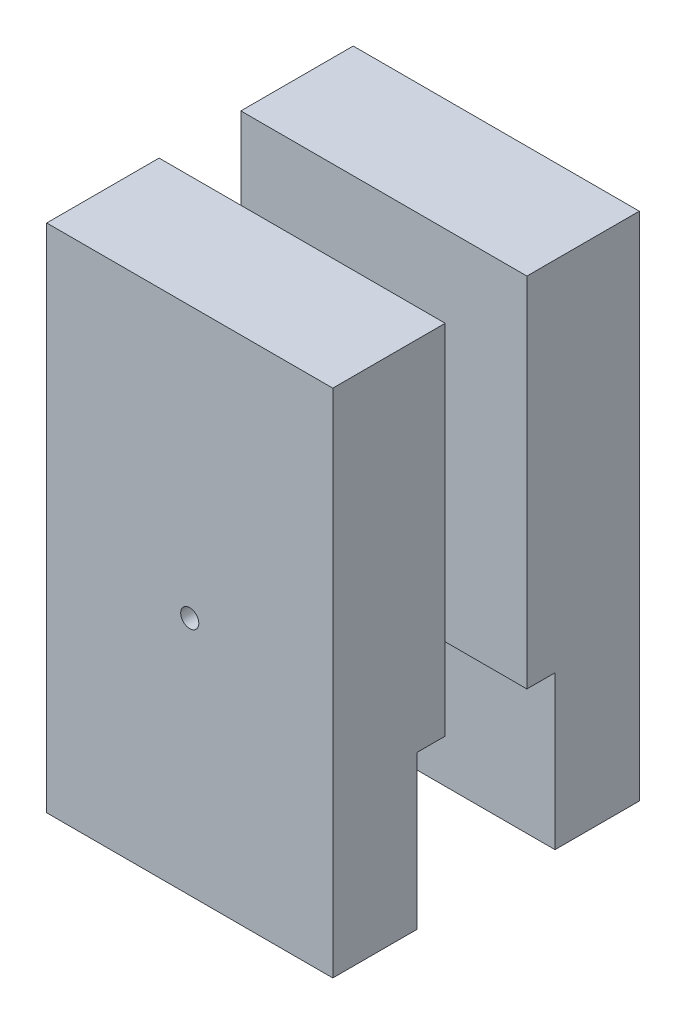
ISO-10303-21;
HEADER;
FILE_DESCRIPTION(('STEP AP214'),'2;1');
FILE_NAME('part.step','',(''),(''),'','','');
FILE_SCHEMA(('AUTOMOTIVE_DESIGN { 1 0 10303 214 1 1 1 1 }'));
ENDSEC;
DATA;
#1=APPLICATION_CONTEXT('core data for automotive mechanical design processes');
#2=APPLICATION_PROTOCOL_DEFINITION('international standard','automotive_design',2000,#1);
#3=PRODUCT_CONTEXT('',#1,'mechanical');
#4=PRODUCT('Part','Part','',(#3));
#5=PRODUCT_RELATED_PRODUCT_CATEGORY('part','',(#4));
#6=PRODUCT_DEFINITION_FORMATION('','',#4);
#7=PRODUCT_DEFINITION_CONTEXT('part definition',#1,'design');
#8=PRODUCT_DEFINITION('design','',#6,#7);
#9=PRODUCT_DEFINITION_SHAPE('','',#8);
#10=(LENGTH_UNIT() NAMED_UNIT(*) SI_UNIT(.MILLI.,.METRE.));
#11=(NAMED_UNIT(*) PLANE_ANGLE_UNIT() SI_UNIT($,.RADIAN.));
#12=(NAMED_UNIT(*) SI_UNIT($,.STERADIAN.) SOLID_ANGLE_UNIT());
#13=UNCERTAINTY_MEASURE_WITH_UNIT(LENGTH_MEASURE(1.E-05),#10,'distance_accuracy_value','');
#14=(GEOMETRIC_REPRESENTATION_CONTEXT(3) GLOBAL_UNCERTAINTY_ASSIGNED_CONTEXT((#13)) GLOBAL_UNIT_ASSIGNED_CONTEXT((#10,
#11,#12)) REPRESENTATION_CONTEXT('',''));
#15=CARTESIAN_POINT('',(0.,0.,0.));
#16=DIRECTION('',(0.,0.,1.));
#17=DIRECTION('',(1.,0.,0.));
#18=AXIS2_PLACEMENT_3D('',#15,#16,#17);
#19=CARTESIAN_POINT('',(17.78,63.5,-19.05));
#20=DIRECTION('',(-1.,0.,0.));
#21=DIRECTION('',(0.,0.,1.));
#22=AXIS2_PLACEMENT_3D('',#19,#20,#21);
#23=PLANE('',#22);
#24=DIRECTION('',(0.,1.,0.));
#25=VECTOR('',#24,1.);
#26=CARTESIAN_POINT('',(17.78,25.4,-5.08));
#27=LINE('',#26,#25);
#28=CARTESIAN_POINT('',(17.78,19.05,-5.08));
#29=VERTEX_POINT('',#28);
#30=CARTESIAN_POINT('',(17.78,63.5,-5.08));
#31=VERTEX_POINT('',#30);
#32=EDGE_CURVE('E172',#29,#31,#27,.T.);
#33=ORIENTED_EDGE('',*,*,#32,.F.);
#34=DIRECTION('',(0.,0.,1.));
#35=VECTOR('',#34,1.);
#36=CARTESIAN_POINT('',(17.78,19.05,-8.5725));
#37=LINE('',#36,#35);
#38=CARTESIAN_POINT('',(17.78,19.05,-8.5725));
#39=VERTEX_POINT('',#38);
#40=EDGE_CURVE('E261',#39,#29,#37,.T.);
#41=ORIENTED_EDGE('',*,*,#40,.F.);
#42=DIRECTION('',(0.,-1.,0.));
#43=VECTOR('',#42,1.);
#44=CARTESIAN_POINT('',(17.78,64.8773938476186,-8.5725));
#45=LINE('',#44,#43);
#46=CARTESIAN_POINT('',(17.78,0.,-8.5725));
#47=VERTEX_POINT('',#46);
#48=EDGE_CURVE('E257',#39,#47,#45,.T.);
#49=ORIENTED_EDGE('',*,*,#48,.T.);
#50=DIRECTION('',(0.,0.,-1.));
#51=VECTOR('',#50,1.);
#52=CARTESIAN_POINT('',(17.78,0.,-19.05));
#53=LINE('',#52,#51);
#54=CARTESIAN_POINT('',(17.78,0.,-19.05));
#55=VERTEX_POINT('',#54);
#56=EDGE_CURVE('E185',#47,#55,#53,.T.);
#57=ORIENTED_EDGE('',*,*,#56,.T.);
#58=DIRECTION('',(0.,-1.,0.));
#59=VECTOR('',#58,1.);
#60=CARTESIAN_POINT('',(17.78,63.5,-19.05));
#61=LINE('',#60,#59);
#62=CARTESIAN_POINT('',(17.78,63.5,-19.05));
#63=VERTEX_POINT('',#62);
#64=EDGE_CURVE('E222',#63,#55,#61,.T.);
#65=ORIENTED_EDGE('',*,*,#64,.F.);
#66=DIRECTION('',(0.,0.,-1.));
#67=VECTOR('',#66,1.);
#68=CARTESIAN_POINT('',(17.78,63.5,-19.05));
#69=LINE('',#68,#67);
#70=EDGE_CURVE('E194',#31,#63,#69,.T.);
#71=ORIENTED_EDGE('',*,*,#70,.F.);
#72=EDGE_LOOP('',(#33,#41,#49,#57,#65,#71));
#73=FACE_BOUND('',#72,.T.);
#74=ADVANCED_FACE('F37',(#73),#23,.F.);
#75=CARTESIAN_POINT('',(-17.78,63.5,-19.05));
#76=DIRECTION('',(1.,0.,0.));
#77=DIRECTION('',(0.,0.,-1.));
#78=AXIS2_PLACEMENT_3D('',#75,#76,#77);
#79=PLANE('',#78);
#80=DIRECTION('',(0.,1.,0.));
#81=VECTOR('',#80,1.);
#82=CARTESIAN_POINT('',(-17.78,25.4,5.08));
#83=LINE('',#82,#81);
#84=CARTESIAN_POINT('',(-17.78,19.05,5.08));
#85=VERTEX_POINT('',#84);
#86=CARTESIAN_POINT('',(-17.78,63.5,5.08));
#87=VERTEX_POINT('',#86);
#88=EDGE_CURVE('E186',#85,#87,#83,.T.);
#89=ORIENTED_EDGE('',*,*,#88,.F.);
#90=DIRECTION('',(0.,0.,-1.));
#91=VECTOR('',#90,1.);
#92=CARTESIAN_POINT('',(-17.78,19.05,-8.5725));
#93=LINE('',#92,#91);
#94=CARTESIAN_POINT('',(-17.78,19.05,8.5725));
#95=VERTEX_POINT('',#94);
#96=EDGE_CURVE('E247',#95,#85,#93,.T.);
#97=ORIENTED_EDGE('',*,*,#96,.F.);
#98=DIRECTION('',(0.,-1.,0.));
#99=VECTOR('',#98,1.);
#100=CARTESIAN_POINT('',(-17.78,64.8773938476186,8.5725));
#101=LINE('',#100,#99);
#102=CARTESIAN_POINT('',(-17.78,0.,8.5725));
#103=VERTEX_POINT('',#102);
#104=EDGE_CURVE('E248',#95,#103,#101,.T.);
#105=ORIENTED_EDGE('',*,*,#104,.T.);
#106=DIRECTION('',(0.,0.,1.));
#107=VECTOR('',#106,1.);
#108=CARTESIAN_POINT('',(-17.78,0.,-19.05));
#109=LINE('',#108,#107);
#110=CARTESIAN_POINT('',(-17.78,0.,19.05));
#111=VERTEX_POINT('',#110);
#112=EDGE_CURVE('E208',#103,#111,#109,.T.);
#113=ORIENTED_EDGE('',*,*,#112,.T.);
#114=DIRECTION('',(0.,-1.,0.));
#115=VECTOR('',#114,1.);
#116=CARTESIAN_POINT('',(-17.78,63.5,19.05));
#117=LINE('',#116,#115);
#118=CARTESIAN_POINT('',(-17.78,63.5,19.05));
#119=VERTEX_POINT('',#118);
#120=EDGE_CURVE('E216',#119,#111,#117,.T.);
#121=ORIENTED_EDGE('',*,*,#120,.F.);
#122=DIRECTION('',(0.,0.,1.));
#123=VECTOR('',#122,1.);
#124=CARTESIAN_POINT('',(-17.78,63.5,-19.05));
#125=LINE('',#124,#123);
#126=EDGE_CURVE('E196',#87,#119,#125,.T.);
#127=ORIENTED_EDGE('',*,*,#126,.F.);
#128=EDGE_LOOP('',(#89,#97,#105,#113,#121,#127));
#129=FACE_BOUND('',#128,.T.);
#130=ADVANCED_FACE('F312',(#129),#79,.F.);
#131=CARTESIAN_POINT('',(0.,25.4,0.));
#132=DIRECTION('',(0.,1.,0.));
#133=DIRECTION('',(0.,0.,1.));
#134=AXIS2_PLACEMENT_3D('',#131,#132,#133);
#135=PLANE('',#134);
#136=DIRECTION('',(0.,0.,-1.));
#137=VECTOR('',#136,1.);
#138=CARTESIAN_POINT('',(-0.635,25.4,0.));
#139=LINE('',#138,#137);
#140=CARTESIAN_POINT('',(-0.635,25.4,5.08));
#141=VERTEX_POINT('',#140);
#142=CARTESIAN_POINT('',(-0.635,25.4,-5.08));
#143=VERTEX_POINT('',#142);
#144=EDGE_CURVE('E152',#141,#143,#139,.T.);
#145=ORIENTED_EDGE('',*,*,#144,.F.);
#146=DIRECTION('',(1.,0.,0.));
#147=VECTOR('',#146,1.);
#148=CARTESIAN_POINT('',(-17.78,25.4,5.08));
#149=LINE('',#148,#147);
#150=CARTESIAN_POINT('',(0.635,25.4,5.08));
#151=VERTEX_POINT('',#150);
#152=EDGE_CURVE('E163',#141,#151,#149,.T.);
#153=ORIENTED_EDGE('',*,*,#152,.T.);
#154=DIRECTION('',(0.,0.,-1.));
#155=VECTOR('',#154,1.);
#156=CARTESIAN_POINT('',(0.635,25.4,0.));
#157=LINE('',#156,#155);
#158=CARTESIAN_POINT('',(0.635,25.4,-5.08));
#159=VERTEX_POINT('',#158);
#160=EDGE_CURVE('E276',#151,#159,#157,.T.);
#161=ORIENTED_EDGE('',*,*,#160,.T.);
#162=DIRECTION('',(-1.,0.,0.));
#163=VECTOR('',#162,1.);
#164=CARTESIAN_POINT('',(-17.78,25.4,-5.08));
#165=LINE('',#164,#163);
#166=EDGE_CURVE('E165',#159,#143,#165,.T.);
#167=ORIENTED_EDGE('',*,*,#166,.T.);
#168=EDGE_LOOP('',(#145,#153,#161,#167));
#169=FACE_BOUND('',#168,.T.);
#170=ADVANCED_FACE('F161',(#169),#135,.T.);
#171=CARTESIAN_POINT('',(0.,0.,0.));
#172=DIRECTION('',(0.,1.,0.));
#173=DIRECTION('',(0.,0.,1.));
#174=AXIS2_PLACEMENT_3D('',#171,#172,#173);
#175=PLANE('',#174);
#176=ORIENTED_EDGE('',*,*,#112,.F.);
#177=DIRECTION('',(-1.,0.,0.));
#178=VECTOR('',#177,1.);
#179=CARTESIAN_POINT('',(-17.78,0.,8.5725));
#180=LINE('',#179,#178);
#181=CARTESIAN_POINT('',(17.78,0.,8.5725));
#182=VERTEX_POINT('',#181);
#183=EDGE_CURVE('E272',#182,#103,#180,.T.);
#184=ORIENTED_EDGE('',*,*,#183,.F.);
#185=CARTESIAN_POINT('',(17.78,0.,19.05));
#186=VERTEX_POINT('',#185);
#187=EDGE_CURVE('E203',#186,#182,#53,.T.);
#188=ORIENTED_EDGE('',*,*,#187,.F.);
#189=DIRECTION('',(1.,0.,0.));
#190=VECTOR('',#189,1.);
#191=CARTESIAN_POINT('',(-17.78,0.,19.05));
#192=LINE('',#191,#190);
#193=EDGE_CURVE('E212',#111,#186,#192,.T.);
#194=ORIENTED_EDGE('',*,*,#193,.F.);
#195=EDGE_LOOP('',(#176,#184,#188,#194));
#196=FACE_BOUND('',#195,.T.);
#197=ADVANCED_FACE('F308',(#196),#175,.F.);
#198=CARTESIAN_POINT('',(0.,63.5,0.));
#199=DIRECTION('',(0.,1.,0.));
#200=DIRECTION('',(0.,0.,1.));
#201=AXIS2_PLACEMENT_3D('',#198,#199,#200);
#202=PLANE('',#201);
#203=DIRECTION('',(1.,0.,0.));
#204=VECTOR('',#203,1.);
#205=CARTESIAN_POINT('',(-17.78,63.5,5.08));
#206=LINE('',#205,#204);
#207=CARTESIAN_POINT('',(17.78,63.5,5.08));
#208=VERTEX_POINT('',#207);
#209=EDGE_CURVE('E176',#87,#208,#206,.T.);
#210=ORIENTED_EDGE('',*,*,#209,.F.);
#211=ORIENTED_EDGE('',*,*,#126,.T.);
#212=DIRECTION('',(1.,0.,0.));
#213=VECTOR('',#212,1.);
#214=CARTESIAN_POINT('',(-17.78,63.5,19.05));
#215=LINE('',#214,#213);
#216=CARTESIAN_POINT('',(17.78,63.5,19.05));
#217=VERTEX_POINT('',#216);
#218=EDGE_CURVE('E200',#119,#217,#215,.T.);
#219=ORIENTED_EDGE('',*,*,#218,.T.);
#220=EDGE_CURVE('E190',#217,#208,#69,.T.);
#221=ORIENTED_EDGE('',*,*,#220,.T.);
#222=EDGE_LOOP('',(#210,#211,#219,#221));
#223=FACE_BOUND('',#222,.T.);
#224=ADVANCED_FACE('F316',(#223),#202,.T.);
#225=CARTESIAN_POINT('',(17.78,19.05,5.08));
#226=VERTEX_POINT('',#225);
#227=CARTESIAN_POINT('',(17.78,19.05,8.5725));
#228=VERTEX_POINT('',#227);
#229=EDGE_CURVE('E260',#226,#228,#37,.T.);
#230=ORIENTED_EDGE('',*,*,#229,.F.);
#231=DIRECTION('',(0.,1.,0.));
#232=VECTOR('',#231,1.);
#233=CARTESIAN_POINT('',(17.78,25.4,5.08));
#234=LINE('',#233,#232);
#235=EDGE_CURVE('E61',#226,#208,#234,.T.);
#236=ORIENTED_EDGE('',*,*,#235,.T.);
#237=ORIENTED_EDGE('',*,*,#220,.F.);
#238=DIRECTION('',(0.,-1.,0.));
#239=VECTOR('',#238,1.);
#240=CARTESIAN_POINT('',(17.78,63.5,19.05));
#241=LINE('',#240,#239);
#242=EDGE_CURVE('E202',#217,#186,#241,.T.);
#243=ORIENTED_EDGE('',*,*,#242,.T.);
#244=ORIENTED_EDGE('',*,*,#187,.T.);
#245=DIRECTION('',(0.,-1.,0.));
#246=VECTOR('',#245,1.);
#247=CARTESIAN_POINT('',(17.78,64.8773938476186,8.5725));
#248=LINE('',#247,#246);
#249=EDGE_CURVE('E182',#228,#182,#248,.T.);
#250=ORIENTED_EDGE('',*,*,#249,.F.);
#251=EDGE_LOOP('',(#230,#236,#237,#243,#244,#250));
#252=FACE_BOUND('',#251,.T.);
#253=ADVANCED_FACE('F39',(#252),#23,.F.);
#254=CARTESIAN_POINT('',(-17.78,63.5,-19.05));
#255=DIRECTION('',(0.,0.,1.));
#256=DIRECTION('',(1.,0.,0.));
#257=AXIS2_PLACEMENT_3D('',#254,#255,#256);
#258=PLANE('',#257);
#259=CARTESIAN_POINT('',(0.,29.845,-19.05));
#260=DIRECTION('',(0.,0.,1.));
#261=DIRECTION('',(1.,0.,0.));
#262=AXIS2_PLACEMENT_3D('',#259,#260,#261);
#263=CIRCLE('',#262,1.125);
#264=CARTESIAN_POINT('',(1.125,29.845,-19.05));
#265=VERTEX_POINT('',#264);
#266=EDGE_CURVE('E283',#265,#265,#263,.T.);
#267=ORIENTED_EDGE('',*,*,#266,.T.);
#268=EDGE_LOOP('',(#267));
#269=FACE_BOUND('',#268,.T.);
#270=DIRECTION('',(-1.,0.,0.));
#271=VECTOR('',#270,1.);
#272=CARTESIAN_POINT('',(-17.78,0.,-19.05));
#273=LINE('',#272,#271);
#274=CARTESIAN_POINT('',(-17.78,0.,-19.05));
#275=VERTEX_POINT('',#274);
#276=EDGE_CURVE('E206',#55,#275,#273,.T.);
#277=ORIENTED_EDGE('',*,*,#276,.T.);
#278=DIRECTION('',(0.,-1.,0.));
#279=VECTOR('',#278,1.);
#280=CARTESIAN_POINT('',(-17.78,63.5,-19.05));
#281=LINE('',#280,#279);
#282=CARTESIAN_POINT('',(-17.78,63.5,-19.05));
#283=VERTEX_POINT('',#282);
#284=EDGE_CURVE('E219',#283,#275,#281,.T.);
#285=ORIENTED_EDGE('',*,*,#284,.F.);
#286=DIRECTION('',(-1.,0.,0.));
#287=VECTOR('',#286,1.);
#288=CARTESIAN_POINT('',(-17.78,63.5,-19.05));
#289=LINE('',#288,#287);
#290=EDGE_CURVE('E193',#63,#283,#289,.T.);
#291=ORIENTED_EDGE('',*,*,#290,.F.);
#292=ORIENTED_EDGE('',*,*,#64,.T.);
#293=EDGE_LOOP('',(#277,#285,#291,#292));
#294=FACE_BOUND('',#293,.T.);
#295=ADVANCED_FACE('F323',(#269,#294),#258,.F.);
#296=CARTESIAN_POINT('',(-17.78,19.05,-5.08));
#297=VERTEX_POINT('',#296);
#298=CARTESIAN_POINT('',(-17.78,19.05,-8.5725));
#299=VERTEX_POINT('',#298);
#300=EDGE_CURVE('E239',#297,#299,#93,.T.);
#301=ORIENTED_EDGE('',*,*,#300,.F.);
#302=DIRECTION('',(0.,1.,0.));
#303=VECTOR('',#302,1.);
#304=CARTESIAN_POINT('',(-17.78,25.4,-5.08));
#305=LINE('',#304,#303);
#306=CARTESIAN_POINT('',(-17.78,63.5,-5.08));
#307=VERTEX_POINT('',#306);
#308=EDGE_CURVE('E174',#297,#307,#305,.T.);
#309=ORIENTED_EDGE('',*,*,#308,.T.);
#310=EDGE_CURVE('E197',#283,#307,#125,.T.);
#311=ORIENTED_EDGE('',*,*,#310,.F.);
#312=ORIENTED_EDGE('',*,*,#284,.T.);
#313=CARTESIAN_POINT('',(-17.78,0.,-8.5725));
#314=VERTEX_POINT('',#313);
#315=EDGE_CURVE('E209',#275,#314,#109,.T.);
#316=ORIENTED_EDGE('',*,*,#315,.T.);
#317=DIRECTION('',(0.,-1.,0.));
#318=VECTOR('',#317,1.);
#319=CARTESIAN_POINT('',(-17.78,64.8773938476186,-8.5725));
#320=LINE('',#319,#318);
#321=EDGE_CURVE('E246',#299,#314,#320,.T.);
#322=ORIENTED_EDGE('',*,*,#321,.F.);
#323=EDGE_LOOP('',(#301,#309,#311,#312,#316,#322));
#324=FACE_BOUND('',#323,.T.);
#325=ADVANCED_FACE('F244',(#324),#79,.F.);
#326=CARTESIAN_POINT('',(-17.78,63.5,19.05));
#327=DIRECTION('',(0.,0.,-1.));
#328=DIRECTION('',(-1.,0.,0.));
#329=AXIS2_PLACEMENT_3D('',#326,#327,#328);
#330=PLANE('',#329);
#331=CARTESIAN_POINT('',(0.,29.845,19.05));
#332=DIRECTION('',(0.,0.,1.));
#333=DIRECTION('',(1.,0.,0.));
#334=AXIS2_PLACEMENT_3D('',#331,#332,#333);
#335=CIRCLE('',#334,1.125);
#336=CARTESIAN_POINT('',(1.125,29.845,19.05));
#337=VERTEX_POINT('',#336);
#338=EDGE_CURVE('E286',#337,#337,#335,.T.);
#339=ORIENTED_EDGE('',*,*,#338,.F.);
#340=EDGE_LOOP('',(#339));
#341=FACE_BOUND('',#340,.T.);
#342=ORIENTED_EDGE('',*,*,#193,.T.);
#343=ORIENTED_EDGE('',*,*,#242,.F.);
#344=ORIENTED_EDGE('',*,*,#218,.F.);
#345=ORIENTED_EDGE('',*,*,#120,.T.);
#346=EDGE_LOOP('',(#342,#343,#344,#345));
#347=FACE_BOUND('',#346,.T.);
#348=ADVANCED_FACE('F293',(#341,#347),#330,.F.);
#349=DIRECTION('',(-1.,0.,0.));
#350=VECTOR('',#349,1.);
#351=CARTESIAN_POINT('',(-17.78,63.5,-5.08));
#352=LINE('',#351,#350);
#353=EDGE_CURVE('E180',#31,#307,#352,.T.);
#354=ORIENTED_EDGE('',*,*,#353,.F.);
#355=ORIENTED_EDGE('',*,*,#70,.T.);
#356=ORIENTED_EDGE('',*,*,#290,.T.);
#357=ORIENTED_EDGE('',*,*,#310,.T.);
#358=EDGE_LOOP('',(#354,#355,#356,#357));
#359=FACE_BOUND('',#358,.T.);
#360=ADVANCED_FACE('F296',(#359),#202,.T.);
#361=ORIENTED_EDGE('',*,*,#56,.F.);
#362=DIRECTION('',(1.,0.,0.));
#363=VECTOR('',#362,1.);
#364=CARTESIAN_POINT('',(-17.78,0.,-8.5725));
#365=LINE('',#364,#363);
#366=EDGE_CURVE('E271',#314,#47,#365,.T.);
#367=ORIENTED_EDGE('',*,*,#366,.F.);
#368=ORIENTED_EDGE('',*,*,#315,.F.);
#369=ORIENTED_EDGE('',*,*,#276,.F.);
#370=EDGE_LOOP('',(#361,#367,#368,#369));
#371=FACE_BOUND('',#370,.T.);
#372=ADVANCED_FACE('F325',(#371),#175,.F.);
#373=CARTESIAN_POINT('',(-17.78,25.4,5.08));
#374=DIRECTION('',(0.,0.,1.));
#375=DIRECTION('',(1.,0.,0.));
#376=AXIS2_PLACEMENT_3D('',#373,#374,#375);
#377=PLANE('',#376);
#378=CARTESIAN_POINT('',(0.,29.845,5.08));
#379=DIRECTION('',(0.,0.,1.));
#380=DIRECTION('',(1.,0.,0.));
#381=AXIS2_PLACEMENT_3D('',#378,#379,#380);
#382=CIRCLE('',#381,1.125);
#383=CARTESIAN_POINT('',(1.125,29.845,5.08));
#384=VERTEX_POINT('',#383);
#385=EDGE_CURVE('E278',#384,#384,#382,.T.);
#386=ORIENTED_EDGE('',*,*,#385,.T.);
#387=EDGE_LOOP('',(#386));
#388=FACE_BOUND('',#387,.T.);
#389=ORIENTED_EDGE('',*,*,#209,.T.);
#390=ORIENTED_EDGE('',*,*,#235,.F.);
#391=DIRECTION('',(1.,0.,0.));
#392=VECTOR('',#391,1.);
#393=CARTESIAN_POINT('',(0.,19.05,5.08));
#394=LINE('',#393,#392);
#395=CARTESIAN_POINT('',(0.635,19.05,5.08));
#396=VERTEX_POINT('',#395);
#397=EDGE_CURVE('E225',#396,#226,#394,.T.);
#398=ORIENTED_EDGE('',*,*,#397,.F.);
#399=DIRECTION('',(0.,1.,0.));
#400=VECTOR('',#399,1.);
#401=CARTESIAN_POINT('',(0.635,0.,5.08));
#402=LINE('',#401,#400);
#403=EDGE_CURVE('E170',#396,#151,#402,.T.);
#404=ORIENTED_EDGE('',*,*,#403,.T.);
#405=ORIENTED_EDGE('',*,*,#152,.F.);
#406=DIRECTION('',(0.,1.,0.));
#407=VECTOR('',#406,1.);
#408=CARTESIAN_POINT('',(-0.635,0.,5.08));
#409=LINE('',#408,#407);
#410=CARTESIAN_POINT('',(-0.635,19.05,5.08));
#411=VERTEX_POINT('',#410);
#412=EDGE_CURVE('E149',#411,#141,#409,.T.);
#413=ORIENTED_EDGE('',*,*,#412,.F.);
#414=DIRECTION('',(1.,0.,0.));
#415=VECTOR('',#414,1.);
#416=CARTESIAN_POINT('',(0.,19.05,5.08));
#417=LINE('',#416,#415);
#418=EDGE_CURVE('E12',#85,#411,#417,.T.);
#419=ORIENTED_EDGE('',*,*,#418,.F.);
#420=ORIENTED_EDGE('',*,*,#88,.T.);
#421=EDGE_LOOP('',(#389,#390,#398,#404,#405,#413,#419,#420));
#422=FACE_BOUND('',#421,.T.);
#423=ADVANCED_FACE('F168',(#388,#422),#377,.F.);
#424=CARTESIAN_POINT('',(-17.78,25.4,-5.08));
#425=DIRECTION('',(0.,0.,-1.));
#426=DIRECTION('',(-1.,0.,0.));
#427=AXIS2_PLACEMENT_3D('',#424,#425,#426);
#428=PLANE('',#427);
#429=CARTESIAN_POINT('',(0.,29.845,-5.08));
#430=DIRECTION('',(0.,0.,-1.));
#431=DIRECTION('',(-1.,0.,0.));
#432=AXIS2_PLACEMENT_3D('',#429,#430,#431);
#433=CIRCLE('',#432,1.125);
#434=CARTESIAN_POINT('',(1.125,29.845,-5.08));
#435=VERTEX_POINT('',#434);
#436=EDGE_CURVE('E41',#435,#435,#433,.T.);
#437=ORIENTED_EDGE('',*,*,#436,.T.);
#438=EDGE_LOOP('',(#437));
#439=FACE_BOUND('',#438,.T.);
#440=ORIENTED_EDGE('',*,*,#353,.T.);
#441=ORIENTED_EDGE('',*,*,#308,.F.);
#442=DIRECTION('',(-1.,0.,0.));
#443=VECTOR('',#442,1.);
#444=CARTESIAN_POINT('',(0.,19.05,-5.08));
#445=LINE('',#444,#443);
#446=CARTESIAN_POINT('',(-0.635,19.05,-5.08));
#447=VERTEX_POINT('',#446);
#448=EDGE_CURVE('E46',#447,#297,#445,.T.);
#449=ORIENTED_EDGE('',*,*,#448,.F.);
#450=DIRECTION('',(0.,1.,0.));
#451=VECTOR('',#450,1.);
#452=CARTESIAN_POINT('',(-0.635,0.,-5.08));
#453=LINE('',#452,#451);
#454=EDGE_CURVE('E53',#447,#143,#453,.T.);
#455=ORIENTED_EDGE('',*,*,#454,.T.);
#456=ORIENTED_EDGE('',*,*,#166,.F.);
#457=DIRECTION('',(0.,1.,0.));
#458=VECTOR('',#457,1.);
#459=CARTESIAN_POINT('',(0.635,0.,-5.08));
#460=LINE('',#459,#458);
#461=CARTESIAN_POINT('',(0.635,19.05,-5.08));
#462=VERTEX_POINT('',#461);
#463=EDGE_CURVE('E166',#462,#159,#460,.T.);
#464=ORIENTED_EDGE('',*,*,#463,.F.);
#465=DIRECTION('',(-1.,0.,0.));
#466=VECTOR('',#465,1.);
#467=CARTESIAN_POINT('',(0.,19.05,-5.08));
#468=LINE('',#467,#466);
#469=EDGE_CURVE('E229',#29,#462,#468,.T.);
#470=ORIENTED_EDGE('',*,*,#469,.F.);
#471=ORIENTED_EDGE('',*,*,#32,.T.);
#472=EDGE_LOOP('',(#440,#441,#449,#455,#456,#464,#470,#471));
#473=FACE_BOUND('',#472,.T.);
#474=ADVANCED_FACE('F340',(#439,#473),#428,.F.);
#475=CARTESIAN_POINT('',(0.,19.05,0.));
#476=DIRECTION('',(0.,1.,0.));
#477=DIRECTION('',(0.,0.,1.));
#478=AXIS2_PLACEMENT_3D('',#475,#476,#477);
#479=PLANE('',#478);
#480=ORIENTED_EDGE('',*,*,#96,.T.);
#481=ORIENTED_EDGE('',*,*,#418,.T.);
#482=DIRECTION('',(0.,0.,-1.));
#483=VECTOR('',#482,1.);
#484=CARTESIAN_POINT('',(-0.635,19.05,0.));
#485=LINE('',#484,#483);
#486=EDGE_CURVE('E155',#411,#447,#485,.T.);
#487=ORIENTED_EDGE('',*,*,#486,.T.);
#488=ORIENTED_EDGE('',*,*,#448,.T.);
#489=ORIENTED_EDGE('',*,*,#300,.T.);
#490=DIRECTION('',(1.,0.,0.));
#491=VECTOR('',#490,1.);
#492=CARTESIAN_POINT('',(-17.78,19.05,-8.5725));
#493=LINE('',#492,#491);
#494=EDGE_CURVE('E255',#299,#39,#493,.T.);
#495=ORIENTED_EDGE('',*,*,#494,.T.);
#496=ORIENTED_EDGE('',*,*,#40,.T.);
#497=ORIENTED_EDGE('',*,*,#469,.T.);
#498=DIRECTION('',(0.,0.,-1.));
#499=VECTOR('',#498,1.);
#500=CARTESIAN_POINT('',(0.635,19.05,0.));
#501=LINE('',#500,#499);
#502=EDGE_CURVE('E227',#396,#462,#501,.T.);
#503=ORIENTED_EDGE('',*,*,#502,.F.);
#504=ORIENTED_EDGE('',*,*,#397,.T.);
#505=ORIENTED_EDGE('',*,*,#229,.T.);
#506=DIRECTION('',(-1.,0.,0.));
#507=VECTOR('',#506,1.);
#508=CARTESIAN_POINT('',(-17.78,19.05,8.5725));
#509=LINE('',#508,#507);
#510=EDGE_CURVE('E251',#228,#95,#509,.T.);
#511=ORIENTED_EDGE('',*,*,#510,.T.);
#512=EDGE_LOOP('',(#480,#481,#487,#488,#489,#495,#496,#497,#503,#504,#505,#511));
#513=FACE_BOUND('',#512,.T.);
#514=ADVANCED_FACE('F237',(#513),#479,.F.);
#515=CARTESIAN_POINT('',(-17.78,64.8773938476186,8.5725));
#516=DIRECTION('',(0.,0.,1.));
#517=DIRECTION('',(1.,0.,0.));
#518=AXIS2_PLACEMENT_3D('',#515,#516,#517);
#519=PLANE('',#518);
#520=ORIENTED_EDGE('',*,*,#249,.T.);
#521=ORIENTED_EDGE('',*,*,#183,.T.);
#522=ORIENTED_EDGE('',*,*,#104,.F.);
#523=ORIENTED_EDGE('',*,*,#510,.F.);
#524=EDGE_LOOP('',(#520,#521,#522,#523));
#525=FACE_BOUND('',#524,.T.);
#526=ADVANCED_FACE('F309',(#525),#519,.F.);
#527=CARTESIAN_POINT('',(-17.78,64.8773938476186,-8.5725));
#528=DIRECTION('',(0.,0.,-1.));
#529=DIRECTION('',(-1.,0.,0.));
#530=AXIS2_PLACEMENT_3D('',#527,#528,#529);
#531=PLANE('',#530);
#532=ORIENTED_EDGE('',*,*,#321,.T.);
#533=ORIENTED_EDGE('',*,*,#366,.T.);
#534=ORIENTED_EDGE('',*,*,#48,.F.);
#535=ORIENTED_EDGE('',*,*,#494,.F.);
#536=EDGE_LOOP('',(#532,#533,#534,#535));
#537=FACE_BOUND('',#536,.T.);
#538=ADVANCED_FACE('F345',(#537),#531,.F.);
#539=CARTESIAN_POINT('',(0.635,0.,0.));
#540=DIRECTION('',(1.,0.,0.));
#541=DIRECTION('',(0.,0.,-1.));
#542=AXIS2_PLACEMENT_3D('',#539,#540,#541);
#543=PLANE('',#542);
#544=ORIENTED_EDGE('',*,*,#502,.T.);
#545=ORIENTED_EDGE('',*,*,#463,.T.);
#546=ORIENTED_EDGE('',*,*,#160,.F.);
#547=ORIENTED_EDGE('',*,*,#403,.F.);
#548=EDGE_LOOP('',(#544,#545,#546,#547));
#549=FACE_BOUND('',#548,.T.);
#550=ADVANCED_FACE('F343',(#549),#543,.T.);
#551=CARTESIAN_POINT('',(-0.635,0.,0.));
#552=DIRECTION('',(1.,0.,0.));
#553=DIRECTION('',(0.,0.,-1.));
#554=AXIS2_PLACEMENT_3D('',#551,#552,#553);
#555=PLANE('',#554);
#556=ORIENTED_EDGE('',*,*,#412,.T.);
#557=ORIENTED_EDGE('',*,*,#144,.T.);
#558=ORIENTED_EDGE('',*,*,#454,.F.);
#559=ORIENTED_EDGE('',*,*,#486,.F.);
#560=EDGE_LOOP('',(#556,#557,#558,#559));
#561=FACE_BOUND('',#560,.T.);
#562=ADVANCED_FACE('F151',(#561),#555,.F.);
#563=CARTESIAN_POINT('',(0.,29.845,-19.05));
#564=DIRECTION('',(0.,0.,1.));
#565=DIRECTION('',(1.,0.,0.));
#566=AXIS2_PLACEMENT_3D('',#563,#564,#565);
#567=CYLINDRICAL_SURFACE('',#566,1.125);
#568=CARTESIAN_POINT('',(1.125,29.845,-19.05));
#569=CARTESIAN_POINT('',(1.125,29.845,-18.9044791666667));
#570=CARTESIAN_POINT('',(1.125,29.845,-18.7589583333333));
#571=CARTESIAN_POINT('',(1.125,29.845,-18.4679166666667));
#572=CARTESIAN_POINT('',(1.125,29.845,-18.3223958333333));
#573=CARTESIAN_POINT('',(1.125,29.845,-18.0313541666667));
#574=CARTESIAN_POINT('',(1.125,29.845,-17.8858333333333));
#575=CARTESIAN_POINT('',(1.125,29.845,-17.5947916666667));
#576=CARTESIAN_POINT('',(1.125,29.845,-17.4492708333333));
#577=CARTESIAN_POINT('',(1.125,29.845,-17.1582291666667));
#578=CARTESIAN_POINT('',(1.125,29.845,-17.0127083333333));
#579=CARTESIAN_POINT('',(1.125,29.845,-16.7216666666667));
#580=CARTESIAN_POINT('',(1.125,29.845,-16.5761458333333));
#581=CARTESIAN_POINT('',(1.125,29.845,-16.2851041666667));
#582=CARTESIAN_POINT('',(1.125,29.845,-16.1395833333333));
#583=CARTESIAN_POINT('',(1.125,29.845,-15.8485416666667));
#584=CARTESIAN_POINT('',(1.125,29.845,-15.7030208333333));
#585=CARTESIAN_POINT('',(1.125,29.845,-15.4119791666667));
#586=CARTESIAN_POINT('',(1.125,29.845,-15.2664583333333));
#587=CARTESIAN_POINT('',(1.125,29.845,-14.9754166666667));
#588=CARTESIAN_POINT('',(1.125,29.845,-14.8298958333333));
#589=CARTESIAN_POINT('',(1.125,29.845,-14.5388541666667));
#590=CARTESIAN_POINT('',(1.125,29.845,-14.3933333333333));
#591=CARTESIAN_POINT('',(1.125,29.845,-14.1022916666667));
#592=CARTESIAN_POINT('',(1.125,29.845,-13.9567708333333));
#593=CARTESIAN_POINT('',(1.125,29.845,-13.6657291666667));
#594=CARTESIAN_POINT('',(1.125,29.845,-13.5202083333333));
#595=CARTESIAN_POINT('',(1.125,29.845,-13.2291666666667));
#596=CARTESIAN_POINT('',(1.125,29.845,-13.0836458333333));
#597=CARTESIAN_POINT('',(1.125,29.845,-12.7926041666667));
#598=CARTESIAN_POINT('',(1.125,29.845,-12.6470833333333));
#599=CARTESIAN_POINT('',(1.125,29.845,-12.3560416666667));
#600=CARTESIAN_POINT('',(1.125,29.845,-12.2105208333333));
#601=CARTESIAN_POINT('',(1.125,29.845,-11.9194791666667));
#602=CARTESIAN_POINT('',(1.125,29.845,-11.7739583333333));
#603=CARTESIAN_POINT('',(1.125,29.845,-11.4829166666667));
#604=CARTESIAN_POINT('',(1.125,29.845,-11.3373958333333));
#605=CARTESIAN_POINT('',(1.125,29.845,-11.0463541666667));
#606=CARTESIAN_POINT('',(1.125,29.845,-10.9008333333333));
#607=CARTESIAN_POINT('',(1.125,29.845,-10.6097916666667));
#608=CARTESIAN_POINT('',(1.125,29.845,-10.4642708333333));
#609=CARTESIAN_POINT('',(1.125,29.845,-10.1732291666667));
#610=CARTESIAN_POINT('',(1.125,29.845,-10.0277083333333));
#611=CARTESIAN_POINT('',(1.125,29.845,-9.73666666666667));
#612=CARTESIAN_POINT('',(1.125,29.845,-9.59114583333334));
#613=CARTESIAN_POINT('',(1.125,29.845,-9.30010416666667));
#614=CARTESIAN_POINT('',(1.125,29.845,-9.15458333333334));
#615=CARTESIAN_POINT('',(1.125,29.845,-8.86354166666667));
#616=CARTESIAN_POINT('',(1.125,29.845,-8.71802083333333));
#617=CARTESIAN_POINT('',(1.125,29.845,-8.42697916666667));
#618=CARTESIAN_POINT('',(1.125,29.845,-8.28145833333333));
#619=CARTESIAN_POINT('',(1.125,29.845,-7.99041666666667));
#620=CARTESIAN_POINT('',(1.125,29.845,-7.84489583333333));
#621=CARTESIAN_POINT('',(1.125,29.845,-7.55385416666667));
#622=CARTESIAN_POINT('',(1.125,29.845,-7.40833333333333));
#623=CARTESIAN_POINT('',(1.125,29.845,-7.11729166666667));
#624=CARTESIAN_POINT('',(1.125,29.845,-6.97177083333333));
#625=CARTESIAN_POINT('',(1.125,29.845,-6.68072916666667));
#626=CARTESIAN_POINT('',(1.125,29.845,-6.53520833333333));
#627=CARTESIAN_POINT('',(1.125,29.845,-6.24416666666667));
#628=CARTESIAN_POINT('',(1.125,29.845,-6.09864583333333));
#629=CARTESIAN_POINT('',(1.125,29.845,-5.80760416666667));
#630=CARTESIAN_POINT('',(1.125,29.845,-5.66208333333333));
#631=CARTESIAN_POINT('',(1.125,29.845,-5.37104166666667));
#632=CARTESIAN_POINT('',(1.125,29.845,-5.22552083333333));
#633=CARTESIAN_POINT('',(1.125,29.845,-5.08));
#634=B_SPLINE_CURVE_WITH_KNOTS('',3,(#568,#569,#570,#571,#572,#573,#574,#575,#576,#577,#578,
#579,#580,#581,#582,#583,#584,#585,#586,#587,#588,#589,#590,#591,#592,#593,#594,#595,#596,#597,
#598,#599,#600,#601,#602,#603,#604,#605,#606,#607,#608,#609,#610,#611,#612,#613,#614,#615,#616,
#617,#618,#619,#620,#621,#622,#623,#624,#625,#626,#627,#628,#629,#630,#631,#632,#633),
.UNSPECIFIED.,.F.,.F.,(4,2,2,2,2,2,2,2,2,2,2,2,2,2,2,2,2,2,2,2,2,2,2,2,2,2,2,2,2,2,2,2,4),(0.,
0.436562499999998,0.873124999999999,1.3096875,1.74625,2.1828125,2.619375,3.0559375,3.4925,
3.9290625,4.365625,4.8021875,5.23875,5.6753125,6.111875,6.5484375,6.985,7.4215625,7.858125,
8.2946875,8.73125,9.1678125,9.604375,10.0409375,10.4775,10.9140625,11.350625,11.7871875,
12.22375,12.6603125,13.096875,13.5334375,13.97),.UNSPECIFIED.);
#635=EDGE_CURVE('BSEAM351',#265,#435,#634,.T.);
#636=ORIENTED_EDGE('',*,*,#266,.F.);
#637=ORIENTED_EDGE('',*,*,#436,.F.);
#638=ORIENTED_EDGE('',*,*,#635,.T.);
#639=ORIENTED_EDGE('',*,*,#635,.F.);
#640=EDGE_LOOP('',(#636,#638,#637,#639));
#641=FACE_BOUND('',#640,.T.);
#642=ADVANCED_FACE('F351',(#641),#567,.F.);
#643=CARTESIAN_POINT('',(1.125,29.845,19.05));
#644=CARTESIAN_POINT('',(1.125,29.845,18.9044791666667));
#645=CARTESIAN_POINT('',(1.125,29.845,18.7589583333333));
#646=CARTESIAN_POINT('',(1.125,29.845,18.4679166666667));
#647=CARTESIAN_POINT('',(1.125,29.845,18.3223958333333));
#648=CARTESIAN_POINT('',(1.125,29.845,18.0313541666667));
#649=CARTESIAN_POINT('',(1.125,29.845,17.8858333333333));
#650=CARTESIAN_POINT('',(1.125,29.845,17.5947916666667));
#651=CARTESIAN_POINT('',(1.125,29.845,17.4492708333333));
#652=CARTESIAN_POINT('',(1.125,29.845,17.1582291666667));
#653=CARTESIAN_POINT('',(1.125,29.845,17.0127083333333));
#654=CARTESIAN_POINT('',(1.125,29.845,16.7216666666667));
#655=CARTESIAN_POINT('',(1.125,29.845,16.5761458333333));
#656=CARTESIAN_POINT('',(1.125,29.845,16.2851041666667));
#657=CARTESIAN_POINT('',(1.125,29.845,16.1395833333333));
#658=CARTESIAN_POINT('',(1.125,29.845,15.8485416666667));
#659=CARTESIAN_POINT('',(1.125,29.845,15.7030208333333));
#660=CARTESIAN_POINT('',(1.125,29.845,15.4119791666667));
#661=CARTESIAN_POINT('',(1.125,29.845,15.2664583333333));
#662=CARTESIAN_POINT('',(1.125,29.845,14.9754166666667));
#663=CARTESIAN_POINT('',(1.125,29.845,14.8298958333333));
#664=CARTESIAN_POINT('',(1.125,29.845,14.5388541666667));
#665=CARTESIAN_POINT('',(1.125,29.845,14.3933333333333));
#666=CARTESIAN_POINT('',(1.125,29.845,14.1022916666667));
#667=CARTESIAN_POINT('',(1.125,29.845,13.9567708333333));
#668=CARTESIAN_POINT('',(1.125,29.845,13.6657291666667));
#669=CARTESIAN_POINT('',(1.125,29.845,13.5202083333333));
#670=CARTESIAN_POINT('',(1.125,29.845,13.2291666666667));
#671=CARTESIAN_POINT('',(1.125,29.845,13.0836458333333));
#672=CARTESIAN_POINT('',(1.125,29.845,12.7926041666667));
#673=CARTESIAN_POINT('',(1.125,29.845,12.6470833333333));
#674=CARTESIAN_POINT('',(1.125,29.845,12.3560416666667));
#675=CARTESIAN_POINT('',(1.125,29.845,12.2105208333333));
#676=CARTESIAN_POINT('',(1.125,29.845,11.9194791666667));
#677=CARTESIAN_POINT('',(1.125,29.845,11.7739583333333));
#678=CARTESIAN_POINT('',(1.125,29.845,11.4829166666667));
#679=CARTESIAN_POINT('',(1.125,29.845,11.3373958333333));
#680=CARTESIAN_POINT('',(1.125,29.845,11.0463541666667));
#681=CARTESIAN_POINT('',(1.125,29.845,10.9008333333333));
#682=CARTESIAN_POINT('',(1.125,29.845,10.6097916666667));
#683=CARTESIAN_POINT('',(1.125,29.845,10.4642708333333));
#684=CARTESIAN_POINT('',(1.125,29.845,10.1732291666667));
#685=CARTESIAN_POINT('',(1.125,29.845,10.0277083333333));
#686=CARTESIAN_POINT('',(1.125,29.845,9.73666666666666));
#687=CARTESIAN_POINT('',(1.125,29.845,9.59114583333333));
#688=CARTESIAN_POINT('',(1.125,29.845,9.30010416666667));
#689=CARTESIAN_POINT('',(1.125,29.845,9.15458333333333));
#690=CARTESIAN_POINT('',(1.125,29.845,8.86354166666666));
#691=CARTESIAN_POINT('',(1.125,29.845,8.71802083333333));
#692=CARTESIAN_POINT('',(1.125,29.845,8.42697916666667));
#693=CARTESIAN_POINT('',(1.125,29.845,8.28145833333333));
#694=CARTESIAN_POINT('',(1.125,29.845,7.99041666666666));
#695=CARTESIAN_POINT('',(1.125,29.845,7.84489583333333));
#696=CARTESIAN_POINT('',(1.125,29.845,7.55385416666666));
#697=CARTESIAN_POINT('',(1.125,29.845,7.40833333333333));
#698=CARTESIAN_POINT('',(1.125,29.845,7.11729166666666));
#699=CARTESIAN_POINT('',(1.125,29.845,6.97177083333333));
#700=CARTESIAN_POINT('',(1.125,29.845,6.68072916666667));
#701=CARTESIAN_POINT('',(1.125,29.845,6.53520833333333));
#702=CARTESIAN_POINT('',(1.125,29.845,6.24416666666666));
#703=CARTESIAN_POINT('',(1.125,29.845,6.09864583333333));
#704=CARTESIAN_POINT('',(1.125,29.845,5.80760416666667));
#705=CARTESIAN_POINT('',(1.125,29.845,5.66208333333333));
#706=CARTESIAN_POINT('',(1.125,29.845,5.37104166666667));
#707=CARTESIAN_POINT('',(1.125,29.845,5.22552083333333));
#708=CARTESIAN_POINT('',(1.125,29.845,5.08));
#709=B_SPLINE_CURVE_WITH_KNOTS('',3,(#643,#644,#645,#646,#647,#648,#649,#650,#651,#652,#653,
#654,#655,#656,#657,#658,#659,#660,#661,#662,#663,#664,#665,#666,#667,#668,#669,#670,#671,#672,
#673,#674,#675,#676,#677,#678,#679,#680,#681,#682,#683,#684,#685,#686,#687,#688,#689,#690,#691,
#692,#693,#694,#695,#696,#697,#698,#699,#700,#701,#702,#703,#704,#705,#706,#707,#708),
.UNSPECIFIED.,.F.,.F.,(4,2,2,2,2,2,2,2,2,2,2,2,2,2,2,2,2,2,2,2,2,2,2,2,2,2,2,2,2,2,2,2,4),(0.,
0.436562500000001,0.873125000000002,1.3096875,1.74625,2.1828125,2.619375,3.0559375,3.4925,
3.9290625,4.365625,4.8021875,5.23875,5.6753125,6.111875,6.5484375,6.985,7.4215625,7.858125,
8.2946875,8.73125,9.1678125,9.604375,10.0409375,10.4775,10.9140625,11.350625,11.7871875,
12.22375,12.6603125,13.096875,13.5334375,13.97),.UNSPECIFIED.);
#710=EDGE_CURVE('BSEAM290',#337,#384,#709,.T.);
#711=ORIENTED_EDGE('',*,*,#338,.T.);
#712=ORIENTED_EDGE('',*,*,#385,.F.);
#713=ORIENTED_EDGE('',*,*,#710,.T.);
#714=ORIENTED_EDGE('',*,*,#710,.F.);
#715=EDGE_LOOP('',(#711,#713,#712,#714));
#716=FACE_BOUND('',#715,.T.);
#717=ADVANCED_FACE('F290',(#716),#567,.F.);
#718=CLOSED_SHELL('',(#74,#130,#170,#197,#224,#253,#295,#325,#348,#360,#372,#423,#474,#514,#526,
#538,#550,#562,#642,#717));
#719=MANIFOLD_SOLID_BREP('B2',#718);
#720=ADVANCED_BREP_SHAPE_REPRESENTATION('',(#18,#719),#14);
#721=SHAPE_DEFINITION_REPRESENTATION(#9,#720);
ENDSEC;
END-ISO-10303-21;
